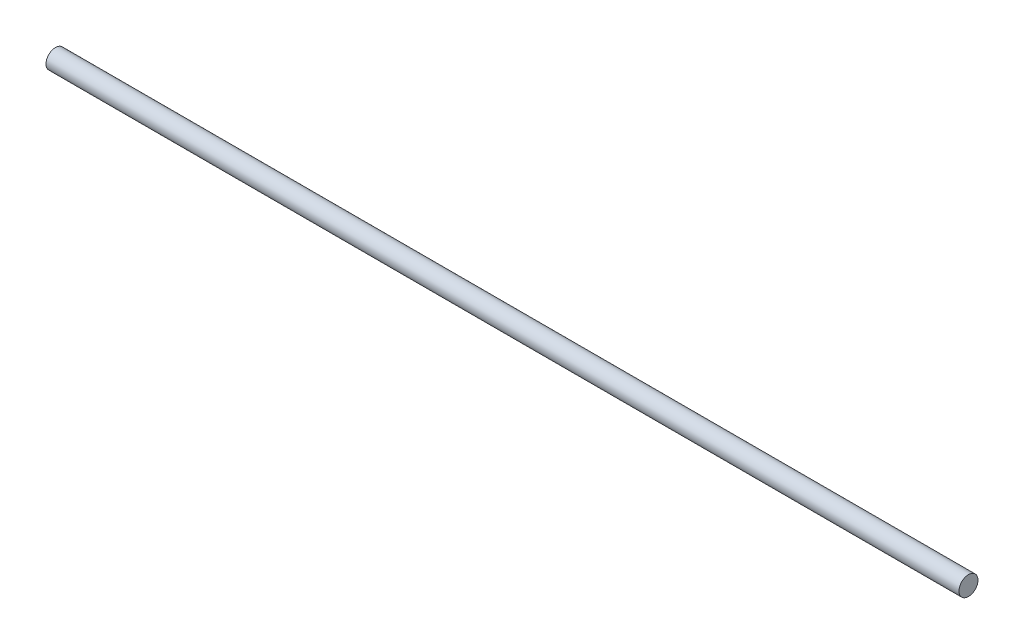
ISO-10303-21;
HEADER;
FILE_DESCRIPTION(('STEP AP214'),'2;1');
FILE_NAME('part.step','',(''),(''),'','','');
FILE_SCHEMA(('AUTOMOTIVE_DESIGN { 1 0 10303 214 1 1 1 1 }'));
ENDSEC;
DATA;
#1=APPLICATION_CONTEXT('core data for automotive mechanical design processes');
#2=APPLICATION_PROTOCOL_DEFINITION('international standard','automotive_design',2000,#1);
#3=PRODUCT_CONTEXT('',#1,'mechanical');
#4=PRODUCT('Part','Part','',(#3));
#5=PRODUCT_RELATED_PRODUCT_CATEGORY('part','',(#4));
#6=PRODUCT_DEFINITION_FORMATION('','',#4);
#7=PRODUCT_DEFINITION_CONTEXT('part definition',#1,'design');
#8=PRODUCT_DEFINITION('design','',#6,#7);
#9=PRODUCT_DEFINITION_SHAPE('','',#8);
#10=(LENGTH_UNIT() NAMED_UNIT(*) SI_UNIT(.MILLI.,.METRE.));
#11=(NAMED_UNIT(*) PLANE_ANGLE_UNIT() SI_UNIT($,.RADIAN.));
#12=(NAMED_UNIT(*) SI_UNIT($,.STERADIAN.) SOLID_ANGLE_UNIT());
#13=UNCERTAINTY_MEASURE_WITH_UNIT(LENGTH_MEASURE(1.E-05),#10,'distance_accuracy_value','');
#14=(GEOMETRIC_REPRESENTATION_CONTEXT(3) GLOBAL_UNCERTAINTY_ASSIGNED_CONTEXT((#13)) GLOBAL_UNIT_ASSIGNED_CONTEXT((#10,
#11,#12)) REPRESENTATION_CONTEXT('',''));
#15=CARTESIAN_POINT('',(0.,0.,0.));
#16=DIRECTION('',(0.,0.,1.));
#17=DIRECTION('',(1.,0.,0.));
#18=AXIS2_PLACEMENT_3D('',#15,#16,#17);
#19=CARTESIAN_POINT('',(-304.8,0.,0.));
#20=DIRECTION('',(1.,0.,0.));
#21=DIRECTION('',(0.,0.,-1.));
#22=AXIS2_PLACEMENT_3D('',#19,#20,#21);
#23=CYLINDRICAL_SURFACE('',#22,3.17499999999997);
#24=CARTESIAN_POINT('',(-304.8,0.,0.));
#25=DIRECTION('',(1.,0.,0.));
#26=DIRECTION('',(0.,0.,-1.));
#27=AXIS2_PLACEMENT_3D('',#24,#25,#26);
#28=CIRCLE('',#27,3.17499999999995);
#29=CARTESIAN_POINT('',(-304.8,0.,-3.17499999999995));
#30=VERTEX_POINT('',#29);
#31=EDGE_CURVE('E10',#30,#30,#28,.T.);
#32=ORIENTED_EDGE('',*,*,#31,.T.);
#33=EDGE_LOOP('',(#32));
#34=FACE_BOUND('',#33,.T.);
#35=CARTESIAN_POINT('',(0.,0.,0.));
#36=DIRECTION('',(1.,0.,0.));
#37=DIRECTION('',(0.,0.,-1.));
#38=AXIS2_PLACEMENT_3D('',#35,#36,#37);
#39=CIRCLE('',#38,3.17499999999998);
#40=CARTESIAN_POINT('',(0.,0.,-3.17499999999998));
#41=VERTEX_POINT('',#40);
#42=EDGE_CURVE('E42',#41,#41,#39,.T.);
#43=ORIENTED_EDGE('',*,*,#42,.F.);
#44=EDGE_LOOP('',(#43));
#45=FACE_BOUND('',#44,.T.);
#46=ADVANCED_FACE('F36',(#34,#45),#23,.T.);
#47=CARTESIAN_POINT('',(-304.8,3.17499999999995,0.));
#48=DIRECTION('',(-1.,0.,0.));
#49=DIRECTION('',(0.,0.,1.));
#50=AXIS2_PLACEMENT_3D('',#47,#48,#49);
#51=PLANE('',#50);
#52=ORIENTED_EDGE('',*,*,#31,.F.);
#53=EDGE_LOOP('',(#52));
#54=FACE_BOUND('',#53,.T.);
#55=ADVANCED_FACE('F51',(#54),#51,.T.);
#56=CARTESIAN_POINT('',(0.,0.,0.));
#57=DIRECTION('',(1.,0.,0.));
#58=DIRECTION('',(0.,0.,-1.));
#59=AXIS2_PLACEMENT_3D('',#56,#57,#58);
#60=PLANE('',#59);
#61=ORIENTED_EDGE('',*,*,#42,.T.);
#62=EDGE_LOOP('',(#61));
#63=FACE_BOUND('',#62,.T.);
#64=ADVANCED_FACE('F48',(#63),#60,.T.);
#65=CLOSED_SHELL('',(#46,#55,#64));
#66=MANIFOLD_SOLID_BREP('B2',#65);
#67=ADVANCED_BREP_SHAPE_REPRESENTATION('',(#18,#66),#14);
#68=SHAPE_DEFINITION_REPRESENTATION(#9,#67);
ENDSEC;
END-ISO-10303-21;
